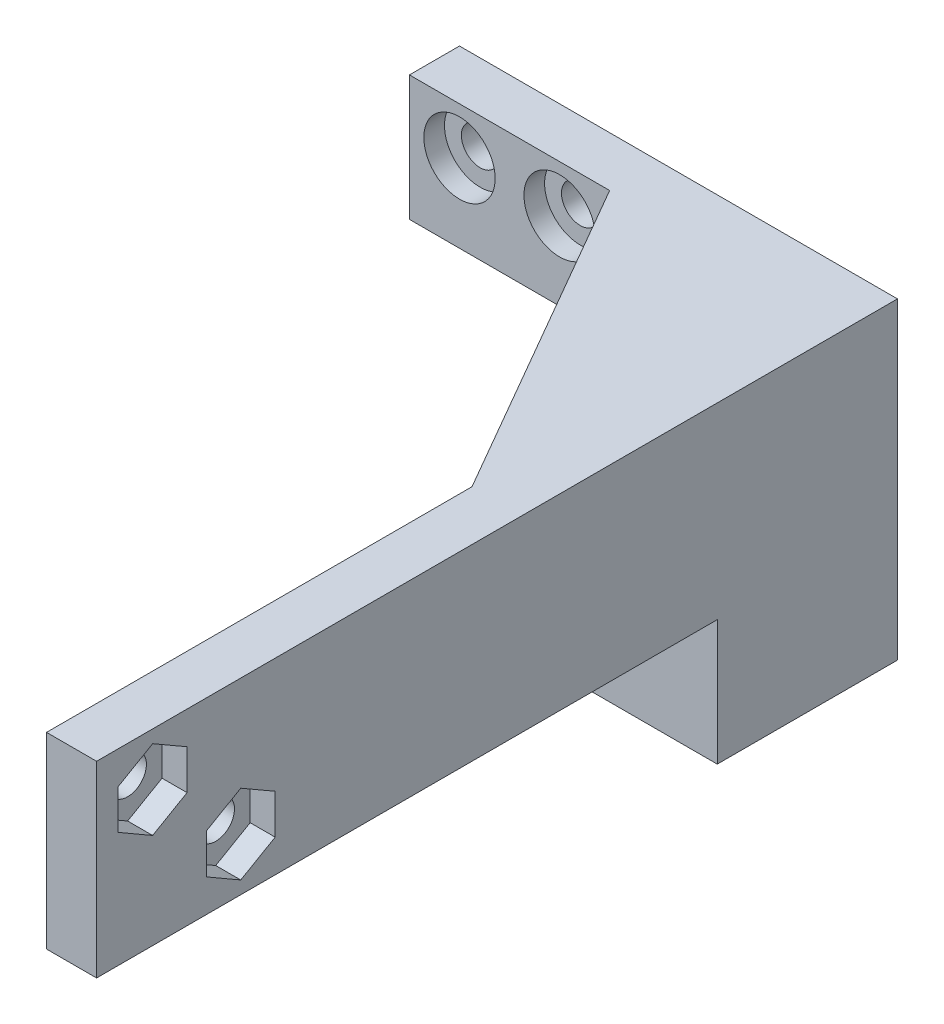
ISO-10303-21;
HEADER;
FILE_DESCRIPTION(('STEP AP214'),'2;1');
FILE_NAME('part.step','',(''),(''),'','','');
FILE_SCHEMA(('AUTOMOTIVE_DESIGN { 1 0 10303 214 1 1 1 1 }'));
ENDSEC;
DATA;
#1=APPLICATION_CONTEXT('core data for automotive mechanical design processes');
#2=APPLICATION_PROTOCOL_DEFINITION('international standard','automotive_design',2000,#1);
#3=PRODUCT_CONTEXT('',#1,'mechanical');
#4=PRODUCT('Part','Part','',(#3));
#5=PRODUCT_RELATED_PRODUCT_CATEGORY('part','',(#4));
#6=PRODUCT_DEFINITION_FORMATION('','',#4);
#7=PRODUCT_DEFINITION_CONTEXT('part definition',#1,'design');
#8=PRODUCT_DEFINITION('design','',#6,#7);
#9=PRODUCT_DEFINITION_SHAPE('','',#8);
#10=(LENGTH_UNIT() NAMED_UNIT(*) SI_UNIT(.MILLI.,.METRE.));
#11=(NAMED_UNIT(*) PLANE_ANGLE_UNIT() SI_UNIT($,.RADIAN.));
#12=(NAMED_UNIT(*) SI_UNIT($,.STERADIAN.) SOLID_ANGLE_UNIT());
#13=UNCERTAINTY_MEASURE_WITH_UNIT(LENGTH_MEASURE(1.E-05),#10,'distance_accuracy_value','');
#14=(GEOMETRIC_REPRESENTATION_CONTEXT(3) GLOBAL_UNCERTAINTY_ASSIGNED_CONTEXT((#13)) GLOBAL_UNIT_ASSIGNED_CONTEXT((#10,
#11,#12)) REPRESENTATION_CONTEXT('',''));
#15=CARTESIAN_POINT('',(0.,0.,0.));
#16=DIRECTION('',(0.,0.,1.));
#17=DIRECTION('',(1.,0.,0.));
#18=AXIS2_PLACEMENT_3D('',#15,#16,#17);
#19=CARTESIAN_POINT('',(86.001,83.5733896832576,59.52));
#20=DIRECTION('',(-1.,0.,0.));
#21=DIRECTION('',(0.,0.,1.));
#22=AXIS2_PLACEMENT_3D('',#19,#20,#21);
#23=CYLINDRICAL_SURFACE('',#22,1.5);
#24=CARTESIAN_POINT('',(82.,83.5733896832576,59.52));
#25=DIRECTION('',(-1.,0.,0.));
#26=DIRECTION('',(0.,0.,1.));
#27=AXIS2_PLACEMENT_3D('',#24,#25,#26);
#28=CIRCLE('',#27,1.5);
#29=CARTESIAN_POINT('',(82.,83.5733896832576,61.02));
#30=VERTEX_POINT('',#29);
#31=EDGE_CURVE('E332',#30,#30,#28,.T.);
#32=ORIENTED_EDGE('',*,*,#31,.T.);
#33=EDGE_LOOP('',(#32));
#34=FACE_BOUND('',#33,.T.);
#35=CARTESIAN_POINT('',(84.,83.5733896832576,59.52));
#36=DIRECTION('',(1.,0.,0.));
#37=DIRECTION('',(0.,0.,-1.));
#38=AXIS2_PLACEMENT_3D('',#35,#36,#37);
#39=CIRCLE('',#38,1.5);
#40=CARTESIAN_POINT('',(84.,83.5733896832576,58.02));
#41=VERTEX_POINT('',#40);
#42=EDGE_CURVE('E335',#41,#41,#39,.F.);
#43=ORIENTED_EDGE('',*,*,#42,.F.);
#44=EDGE_LOOP('',(#43));
#45=FACE_BOUND('',#44,.T.);
#46=ADVANCED_FACE('F37',(#34,#45),#23,.F.);
#47=CARTESIAN_POINT('',(86.001,76.9733896832576,52.48));
#48=DIRECTION('',(-1.,0.,0.));
#49=DIRECTION('',(0.,0.,1.));
#50=AXIS2_PLACEMENT_3D('',#47,#48,#49);
#51=CYLINDRICAL_SURFACE('',#50,1.5);
#52=CARTESIAN_POINT('',(82.,76.9733896832576,52.48));
#53=DIRECTION('',(-1.,0.,0.));
#54=DIRECTION('',(0.,0.,1.));
#55=AXIS2_PLACEMENT_3D('',#52,#53,#54);
#56=CIRCLE('',#55,1.5);
#57=CARTESIAN_POINT('',(82.,76.9733896832576,53.98));
#58=VERTEX_POINT('',#57);
#59=EDGE_CURVE('E328',#58,#58,#56,.T.);
#60=ORIENTED_EDGE('',*,*,#59,.T.);
#61=EDGE_LOOP('',(#60));
#62=FACE_BOUND('',#61,.T.);
#63=CARTESIAN_POINT('',(84.,76.9733896832576,52.48));
#64=DIRECTION('',(1.,0.,0.));
#65=DIRECTION('',(0.,0.,-1.));
#66=AXIS2_PLACEMENT_3D('',#63,#64,#65);
#67=CIRCLE('',#66,1.5);
#68=CARTESIAN_POINT('',(84.,76.9733896832576,50.98));
#69=VERTEX_POINT('',#68);
#70=EDGE_CURVE('E272',#69,#69,#67,.F.);
#71=ORIENTED_EDGE('',*,*,#70,.F.);
#72=EDGE_LOOP('',(#71));
#73=FACE_BOUND('',#72,.T.);
#74=ADVANCED_FACE('F452',(#62,#73),#51,.F.);
#75=CARTESIAN_POINT('',(55.,84.0233896832576,4.));
#76=DIRECTION('',(0.,0.,-1.));
#77=DIRECTION('',(-1.,0.,0.));
#78=AXIS2_PLACEMENT_3D('',#75,#76,#77);
#79=CYLINDRICAL_SURFACE('',#78,1.5);
#80=CARTESIAN_POINT('',(55.,84.0233896832576,0.));
#81=DIRECTION('',(0.,0.,1.));
#82=DIRECTION('',(1.,0.,0.));
#83=AXIS2_PLACEMENT_3D('',#80,#81,#82);
#84=CIRCLE('',#83,1.5);
#85=CARTESIAN_POINT('',(56.5,84.0233896832576,0.));
#86=VERTEX_POINT('',#85);
#87=EDGE_CURVE('E388',#86,#86,#84,.T.);
#88=ORIENTED_EDGE('',*,*,#87,.F.);
#89=EDGE_LOOP('',(#88));
#90=FACE_BOUND('',#89,.T.);
#91=CARTESIAN_POINT('',(55.,84.0233896832576,2.35));
#92=DIRECTION('',(0.,0.,1.));
#93=DIRECTION('',(1.,0.,0.));
#94=AXIS2_PLACEMENT_3D('',#91,#92,#93);
#95=CIRCLE('',#94,1.5);
#96=CARTESIAN_POINT('',(56.5,84.0233896832576,2.35));
#97=VERTEX_POINT('',#96);
#98=EDGE_CURVE('E352',#97,#97,#95,.T.);
#99=ORIENTED_EDGE('',*,*,#98,.T.);
#100=EDGE_LOOP('',(#99));
#101=FACE_BOUND('',#100,.T.);
#102=ADVANCED_FACE('F458',(#90,#101),#79,.F.);
#103=CARTESIAN_POINT('',(63.,84.0233896832576,4.));
#104=DIRECTION('',(0.,0.,-1.));
#105=DIRECTION('',(-1.,0.,0.));
#106=AXIS2_PLACEMENT_3D('',#103,#104,#105);
#107=CYLINDRICAL_SURFACE('',#106,1.5);
#108=CARTESIAN_POINT('',(63.,84.0233896832576,0.));
#109=DIRECTION('',(0.,0.,1.));
#110=DIRECTION('',(1.,0.,0.));
#111=AXIS2_PLACEMENT_3D('',#108,#109,#110);
#112=CIRCLE('',#111,1.5);
#113=CARTESIAN_POINT('',(64.5,84.0233896832576,0.));
#114=VERTEX_POINT('',#113);
#115=EDGE_CURVE('E378',#114,#114,#112,.T.);
#116=ORIENTED_EDGE('',*,*,#115,.F.);
#117=EDGE_LOOP('',(#116));
#118=FACE_BOUND('',#117,.T.);
#119=CARTESIAN_POINT('',(63.,84.0233896832576,2.35));
#120=DIRECTION('',(0.,0.,1.));
#121=DIRECTION('',(1.,0.,0.));
#122=AXIS2_PLACEMENT_3D('',#119,#120,#121);
#123=CIRCLE('',#122,1.5);
#124=CARTESIAN_POINT('',(64.5,84.0233896832576,2.35));
#125=VERTEX_POINT('',#124);
#126=EDGE_CURVE('E339',#125,#125,#123,.T.);
#127=ORIENTED_EDGE('',*,*,#126,.T.);
#128=EDGE_LOOP('',(#127));
#129=FACE_BOUND('',#128,.T.);
#130=ADVANCED_FACE('F490',(#118,#129),#107,.F.);
#131=CARTESIAN_POINT('',(0.,0.,4.));
#132=DIRECTION('',(0.,0.,1.));
#133=DIRECTION('',(1.,0.,0.));
#134=AXIS2_PLACEMENT_3D('',#131,#132,#133);
#135=PLANE('',#134);
#136=DIRECTION('',(-1.,0.,0.));
#137=VECTOR('',#136,1.);
#138=CARTESIAN_POINT('',(1.43909679882495E-13,77.7733896832577,4.));
#139=LINE('',#138,#137);
#140=CARTESIAN_POINT('',(67.,77.7733896832576,4.));
#141=VERTEX_POINT('',#140);
#142=CARTESIAN_POINT('',(51.,77.7733896832576,4.));
#143=VERTEX_POINT('',#142);
#144=EDGE_CURVE('E231',#141,#143,#139,.T.);
#145=ORIENTED_EDGE('',*,*,#144,.F.);
#146=DIRECTION('',(0.,1.,0.));
#147=VECTOR('',#146,1.);
#148=CARTESIAN_POINT('',(67.,42.7567276436504,4.));
#149=LINE('',#148,#147);
#150=CARTESIAN_POINT('',(67.,87.7733896832576,4.));
#151=VERTEX_POINT('',#150);
#152=EDGE_CURVE('E356',#141,#151,#149,.T.);
#153=ORIENTED_EDGE('',*,*,#152,.T.);
#154=DIRECTION('',(-1.,0.,0.));
#155=VECTOR('',#154,1.);
#156=CARTESIAN_POINT('',(0.,87.7733896832577,4.));
#157=LINE('',#156,#155);
#158=CARTESIAN_POINT('',(51.,87.7733896832576,4.));
#159=VERTEX_POINT('',#158);
#160=EDGE_CURVE('E375',#151,#159,#157,.T.);
#161=ORIENTED_EDGE('',*,*,#160,.T.);
#162=DIRECTION('',(0.,-1.,0.));
#163=VECTOR('',#162,1.);
#164=CARTESIAN_POINT('',(50.9999999999999,0.,4.));
#165=LINE('',#164,#163);
#166=EDGE_CURVE('E377',#159,#143,#165,.T.);
#167=ORIENTED_EDGE('',*,*,#166,.T.);
#168=EDGE_LOOP('',(#145,#153,#161,#167));
#169=FACE_BOUND('',#168,.T.);
#170=CARTESIAN_POINT('',(63.,84.0233896832576,4.));
#171=DIRECTION('',(0.,0.,1.));
#172=DIRECTION('',(1.,0.,0.));
#173=AXIS2_PLACEMENT_3D('',#170,#171,#172);
#174=CIRCLE('',#173,2.85);
#175=CARTESIAN_POINT('',(65.85,84.0233896832576,4.));
#176=VERTEX_POINT('',#175);
#177=EDGE_CURVE('E340',#176,#176,#174,.T.);
#178=ORIENTED_EDGE('',*,*,#177,.F.);
#179=EDGE_LOOP('',(#178));
#180=FACE_BOUND('',#179,.T.);
#181=CARTESIAN_POINT('',(55.,84.0233896832576,4.));
#182=DIRECTION('',(0.,0.,1.));
#183=DIRECTION('',(1.,0.,0.));
#184=AXIS2_PLACEMENT_3D('',#181,#182,#183);
#185=CIRCLE('',#184,2.85);
#186=CARTESIAN_POINT('',(57.85,84.0233896832576,4.));
#187=VERTEX_POINT('',#186);
#188=EDGE_CURVE('E331',#187,#187,#185,.T.);
#189=ORIENTED_EDGE('',*,*,#188,.F.);
#190=EDGE_LOOP('',(#189));
#191=FACE_BOUND('',#190,.T.);
#192=ADVANCED_FACE('F434',(#169,#180,#191),#135,.T.);
#193=CARTESIAN_POINT('',(82.,87.7733896832576,64.));
#194=DIRECTION('',(1.,0.,0.));
#195=DIRECTION('',(0.,0.,-1.));
#196=AXIS2_PLACEMENT_3D('',#193,#194,#195);
#197=PLANE('',#196);
#198=ORIENTED_EDGE('',*,*,#59,.F.);
#199=EDGE_LOOP('',(#198));
#200=FACE_BOUND('',#199,.T.);
#201=ORIENTED_EDGE('',*,*,#31,.F.);
#202=EDGE_LOOP('',(#201));
#203=FACE_BOUND('',#202,.T.);
#204=DIRECTION('',(0.,1.,0.));
#205=VECTOR('',#204,1.);
#206=CARTESIAN_POINT('',(82.,42.7567276436504,30.));
#207=LINE('',#206,#205);
#208=CARTESIAN_POINT('',(82.,72.7733896832576,30.));
#209=VERTEX_POINT('',#208);
#210=CARTESIAN_POINT('',(82.,87.7733896832576,30.));
#211=VERTEX_POINT('',#210);
#212=EDGE_CURVE('E351',#209,#211,#207,.T.);
#213=ORIENTED_EDGE('',*,*,#212,.F.);
#214=DIRECTION('',(0.,0.,-1.));
#215=VECTOR('',#214,1.);
#216=CARTESIAN_POINT('',(82.,72.7733896832576,64.));
#217=LINE('',#216,#215);
#218=CARTESIAN_POINT('',(82.,72.7733896832576,64.));
#219=VERTEX_POINT('',#218);
#220=EDGE_CURVE('E369',#219,#209,#217,.T.);
#221=ORIENTED_EDGE('',*,*,#220,.F.);
#222=DIRECTION('',(0.,-1.,0.));
#223=VECTOR('',#222,1.);
#224=CARTESIAN_POINT('',(82.,87.7733896832576,64.));
#225=LINE('',#224,#223);
#226=CARTESIAN_POINT('',(82.,87.7733896832576,64.));
#227=VERTEX_POINT('',#226);
#228=EDGE_CURVE('E364',#227,#219,#225,.T.);
#229=ORIENTED_EDGE('',*,*,#228,.F.);
#230=DIRECTION('',(0.,0.,-1.));
#231=VECTOR('',#230,1.);
#232=CARTESIAN_POINT('',(82.,87.7733896832576,64.));
#233=LINE('',#232,#231);
#234=EDGE_CURVE('E372',#227,#211,#233,.T.);
#235=ORIENTED_EDGE('',*,*,#234,.T.);
#236=EDGE_LOOP('',(#213,#221,#229,#235));
#237=FACE_BOUND('',#236,.T.);
#238=ADVANCED_FACE('F426',(#200,#203,#237),#197,.F.);
#239=CARTESIAN_POINT('',(0.,87.7733896832577,4.));
#240=DIRECTION('',(0.,-1.,0.));
#241=DIRECTION('',(1.,0.,0.));
#242=AXIS2_PLACEMENT_3D('',#239,#240,#241);
#243=PLANE('',#242);
#244=ORIENTED_EDGE('',*,*,#160,.F.);
#245=DIRECTION('',(0.499722453489578,0.,0.8661855860486));
#246=VECTOR('',#245,1.);
#247=CARTESIAN_POINT('',(67.,87.7733896832576,3.99999999999999));
#248=LINE('',#247,#246);
#249=EDGE_CURVE('E348',#151,#211,#248,.T.);
#250=ORIENTED_EDGE('',*,*,#249,.T.);
#251=ORIENTED_EDGE('',*,*,#234,.F.);
#252=DIRECTION('',(-1.,0.,0.));
#253=VECTOR('',#252,1.);
#254=CARTESIAN_POINT('',(86.,87.7733896832576,64.));
#255=LINE('',#254,#253);
#256=CARTESIAN_POINT('',(86.,87.7733896832576,64.));
#257=VERTEX_POINT('',#256);
#258=EDGE_CURVE('E362',#257,#227,#255,.T.);
#259=ORIENTED_EDGE('',*,*,#258,.F.);
#260=DIRECTION('',(0.,0.,-1.));
#261=VECTOR('',#260,1.);
#262=CARTESIAN_POINT('',(86.,87.7733896832576,4.));
#263=LINE('',#262,#261);
#264=CARTESIAN_POINT('',(86.,87.7733896832576,0.));
#265=VERTEX_POINT('',#264);
#266=EDGE_CURVE('E381',#257,#265,#263,.T.);
#267=ORIENTED_EDGE('',*,*,#266,.T.);
#268=DIRECTION('',(-1.,0.,0.));
#269=VECTOR('',#268,1.);
#270=CARTESIAN_POINT('',(0.,87.7733896832577,0.));
#271=LINE('',#270,#269);
#272=CARTESIAN_POINT('',(51.,87.7733896832576,0.));
#273=VERTEX_POINT('',#272);
#274=EDGE_CURVE('E374',#265,#273,#271,.T.);
#275=ORIENTED_EDGE('',*,*,#274,.T.);
#276=DIRECTION('',(0.,0.,-1.));
#277=VECTOR('',#276,1.);
#278=CARTESIAN_POINT('',(51.,87.7733896832576,4.));
#279=LINE('',#278,#277);
#280=EDGE_CURVE('E396',#159,#273,#279,.T.);
#281=ORIENTED_EDGE('',*,*,#280,.F.);
#282=EDGE_LOOP('',(#244,#250,#251,#259,#267,#275,#281));
#283=FACE_BOUND('',#282,.T.);
#284=ADVANCED_FACE('F39',(#283),#243,.F.);
#285=CARTESIAN_POINT('',(50.9999999999999,0.,4.));
#286=DIRECTION('',(1.,0.,0.));
#287=DIRECTION('',(0.,1.,0.));
#288=AXIS2_PLACEMENT_3D('',#285,#286,#287);
#289=PLANE('',#288);
#290=DIRECTION('',(0.,-1.,0.));
#291=VECTOR('',#290,1.);
#292=CARTESIAN_POINT('',(50.9999999999999,0.,0.));
#293=LINE('',#292,#291);
#294=CARTESIAN_POINT('',(51.,77.7733896832576,0.));
#295=VERTEX_POINT('',#294);
#296=EDGE_CURVE('E384',#273,#295,#293,.T.);
#297=ORIENTED_EDGE('',*,*,#296,.T.);
#298=DIRECTION('',(0.,0.,-1.));
#299=VECTOR('',#298,1.);
#300=CARTESIAN_POINT('',(51.,77.7733896832576,0.));
#301=LINE('',#300,#299);
#302=EDGE_CURVE('E200',#143,#295,#301,.T.);
#303=ORIENTED_EDGE('',*,*,#302,.F.);
#304=ORIENTED_EDGE('',*,*,#166,.F.);
#305=ORIENTED_EDGE('',*,*,#280,.T.);
#306=EDGE_LOOP('',(#297,#303,#304,#305));
#307=FACE_BOUND('',#306,.T.);
#308=ADVANCED_FACE('F438',(#307),#289,.F.);
#309=CARTESIAN_POINT('',(0.,72.7733896832576,4.));
#310=DIRECTION('',(0.,-1.,0.));
#311=DIRECTION('',(0.,0.,-1.));
#312=AXIS2_PLACEMENT_3D('',#309,#310,#311);
#313=PLANE('',#312);
#314=DIRECTION('',(-1.,0.,0.));
#315=VECTOR('',#314,1.);
#316=CARTESIAN_POINT('',(73.,72.7733896832576,14.4));
#317=LINE('',#316,#315);
#318=CARTESIAN_POINT('',(86.,72.7733896832576,14.4));
#319=VERTEX_POINT('',#318);
#320=CARTESIAN_POINT('',(73.,72.7733896832576,14.4));
#321=VERTEX_POINT('',#320);
#322=EDGE_CURVE('E52',#319,#321,#317,.T.);
#323=ORIENTED_EDGE('',*,*,#322,.F.);
#324=DIRECTION('',(0.,0.,-1.));
#325=VECTOR('',#324,1.);
#326=CARTESIAN_POINT('',(86.,72.7733896832576,4.));
#327=LINE('',#326,#325);
#328=CARTESIAN_POINT('',(86.,72.7733896832576,64.));
#329=VERTEX_POINT('',#328);
#330=EDGE_CURVE('E394',#329,#319,#327,.T.);
#331=ORIENTED_EDGE('',*,*,#330,.F.);
#332=DIRECTION('',(1.,0.,0.));
#333=VECTOR('',#332,1.);
#334=CARTESIAN_POINT('',(86.,72.7733896832576,64.));
#335=LINE('',#334,#333);
#336=EDGE_CURVE('E366',#219,#329,#335,.T.);
#337=ORIENTED_EDGE('',*,*,#336,.F.);
#338=ORIENTED_EDGE('',*,*,#220,.T.);
#339=DIRECTION('',(-0.499722453489578,0.,-0.8661855860486));
#340=VECTOR('',#339,1.);
#341=CARTESIAN_POINT('',(67.,72.7733896832576,4.));
#342=LINE('',#341,#340);
#343=EDGE_CURVE('E353',#209,#321,#342,.T.);
#344=ORIENTED_EDGE('',*,*,#343,.T.);
#345=EDGE_LOOP('',(#323,#331,#337,#338,#344));
#346=FACE_BOUND('',#345,.T.);
#347=ADVANCED_FACE('F418',(#346),#313,.T.);
#348=CARTESIAN_POINT('',(86.,0.,4.));
#349=DIRECTION('',(1.,0.,0.));
#350=DIRECTION('',(0.,0.,-1.));
#351=AXIS2_PLACEMENT_3D('',#348,#349,#350);
#352=PLANE('',#351);
#353=DIRECTION('',(0.,-1.,0.));
#354=VECTOR('',#353,1.);
#355=CARTESIAN_POINT('',(86.,78.5611029235291,55.23));
#356=LINE('',#355,#354);
#357=CARTESIAN_POINT('',(86.,78.5611029235291,55.23));
#358=VERTEX_POINT('',#357);
#359=CARTESIAN_POINT('',(86.,75.3856764429861,55.23));
#360=VERTEX_POINT('',#359);
#361=EDGE_CURVE('E60',#358,#360,#356,.T.);
#362=ORIENTED_EDGE('',*,*,#361,.F.);
#363=DIRECTION('',(0.,-0.5,0.866025403784439));
#364=VECTOR('',#363,1.);
#365=CARTESIAN_POINT('',(86.,80.1488161638006,52.48));
#366=LINE('',#365,#364);
#367=CARTESIAN_POINT('',(86.,80.1488161638006,52.48));
#368=VERTEX_POINT('',#367);
#369=EDGE_CURVE('E238',#368,#358,#366,.T.);
#370=ORIENTED_EDGE('',*,*,#369,.F.);
#371=DIRECTION('',(0.,0.500000000000002,0.866025403784438));
#372=VECTOR('',#371,1.);
#373=CARTESIAN_POINT('',(86.,78.5611029235291,49.73));
#374=LINE('',#373,#372);
#375=CARTESIAN_POINT('',(86.,78.5611029235291,49.73));
#376=VERTEX_POINT('',#375);
#377=EDGE_CURVE('E265',#376,#368,#374,.T.);
#378=ORIENTED_EDGE('',*,*,#377,.F.);
#379=DIRECTION('',(0.,1.,0.));
#380=VECTOR('',#379,1.);
#381=CARTESIAN_POINT('',(86.,75.3856764429862,49.73));
#382=LINE('',#381,#380);
#383=CARTESIAN_POINT('',(86.,75.3856764429862,49.73));
#384=VERTEX_POINT('',#383);
#385=EDGE_CURVE('E262',#384,#376,#382,.T.);
#386=ORIENTED_EDGE('',*,*,#385,.F.);
#387=DIRECTION('',(0.,0.5,-0.866025403784438));
#388=VECTOR('',#387,1.);
#389=CARTESIAN_POINT('',(86.,73.7979632027147,52.48));
#390=LINE('',#389,#388);
#391=CARTESIAN_POINT('',(86.,73.7979632027147,52.48));
#392=VERTEX_POINT('',#391);
#393=EDGE_CURVE('E259',#392,#384,#390,.T.);
#394=ORIENTED_EDGE('',*,*,#393,.F.);
#395=DIRECTION('',(0.,-0.500000000000001,-0.866025403784438));
#396=VECTOR('',#395,1.);
#397=CARTESIAN_POINT('',(86.,75.3856764429862,55.23));
#398=LINE('',#397,#396);
#399=EDGE_CURVE('E255',#360,#392,#398,.T.);
#400=ORIENTED_EDGE('',*,*,#399,.F.);
#401=EDGE_LOOP('',(#362,#370,#378,#386,#394,#400));
#402=FACE_BOUND('',#401,.T.);
#403=DIRECTION('',(0.,-1.,0.));
#404=VECTOR('',#403,1.);
#405=CARTESIAN_POINT('',(86.,85.1611029235291,62.27));
#406=LINE('',#405,#404);
#407=CARTESIAN_POINT('',(86.,85.1611029235291,62.27));
#408=VERTEX_POINT('',#407);
#409=CARTESIAN_POINT('',(86.,81.9856764429862,62.27));
#410=VERTEX_POINT('',#409);
#411=EDGE_CURVE('E233',#408,#410,#406,.T.);
#412=ORIENTED_EDGE('',*,*,#411,.F.);
#413=DIRECTION('',(0.,-0.499999999999999,0.866025403784439));
#414=VECTOR('',#413,1.);
#415=CARTESIAN_POINT('',(86.,86.7488161638006,59.52));
#416=LINE('',#415,#414);
#417=CARTESIAN_POINT('',(86.,86.7488161638006,59.52));
#418=VERTEX_POINT('',#417);
#419=EDGE_CURVE('E286',#418,#408,#416,.T.);
#420=ORIENTED_EDGE('',*,*,#419,.F.);
#421=DIRECTION('',(0.,0.499999999999999,0.866025403784439));
#422=VECTOR('',#421,1.);
#423=CARTESIAN_POINT('',(86.,85.1611029235291,56.77));
#424=LINE('',#423,#422);
#425=CARTESIAN_POINT('',(86.,85.1611029235291,56.77));
#426=VERTEX_POINT('',#425);
#427=EDGE_CURVE('E312',#426,#418,#424,.T.);
#428=ORIENTED_EDGE('',*,*,#427,.F.);
#429=DIRECTION('',(0.,1.,0.));
#430=VECTOR('',#429,1.);
#431=CARTESIAN_POINT('',(86.,81.9856764429862,56.77));
#432=LINE('',#431,#430);
#433=CARTESIAN_POINT('',(86.,81.9856764429862,56.77));
#434=VERTEX_POINT('',#433);
#435=EDGE_CURVE('E309',#434,#426,#432,.T.);
#436=ORIENTED_EDGE('',*,*,#435,.F.);
#437=DIRECTION('',(0.,0.499999999999998,-0.86602540378444));
#438=VECTOR('',#437,1.);
#439=CARTESIAN_POINT('',(86.,80.3979632027147,59.52));
#440=LINE('',#439,#438);
#441=CARTESIAN_POINT('',(86.,80.3979632027147,59.52));
#442=VERTEX_POINT('',#441);
#443=EDGE_CURVE('E306',#442,#434,#440,.T.);
#444=ORIENTED_EDGE('',*,*,#443,.F.);
#445=DIRECTION('',(0.,-0.499999999999997,-0.86602540378444));
#446=VECTOR('',#445,1.);
#447=CARTESIAN_POINT('',(86.,81.9856764429862,62.27));
#448=LINE('',#447,#446);
#449=EDGE_CURVE('E303',#410,#442,#448,.T.);
#450=ORIENTED_EDGE('',*,*,#449,.F.);
#451=EDGE_LOOP('',(#412,#420,#428,#436,#444,#450));
#452=FACE_BOUND('',#451,.T.);
#453=DIRECTION('',(0.,-1.,0.));
#454=VECTOR('',#453,1.);
#455=CARTESIAN_POINT('',(86.,0.,0.));
#456=LINE('',#455,#454);
#457=CARTESIAN_POINT('',(86.,62.7733896832576,0.));
#458=VERTEX_POINT('',#457);
#459=EDGE_CURVE('E208',#265,#458,#456,.T.);
#460=ORIENTED_EDGE('',*,*,#459,.F.);
#461=ORIENTED_EDGE('',*,*,#266,.F.);
#462=DIRECTION('',(0.,1.,0.));
#463=VECTOR('',#462,1.);
#464=CARTESIAN_POINT('',(86.,87.7733896832576,64.));
#465=LINE('',#464,#463);
#466=EDGE_CURVE('E355',#329,#257,#465,.T.);
#467=ORIENTED_EDGE('',*,*,#466,.F.);
#468=ORIENTED_EDGE('',*,*,#330,.T.);
#469=DIRECTION('',(0.,1.,0.));
#470=VECTOR('',#469,1.);
#471=CARTESIAN_POINT('',(86.,62.7733896832576,14.4));
#472=LINE('',#471,#470);
#473=CARTESIAN_POINT('',(86.,62.7733896832576,14.4));
#474=VERTEX_POINT('',#473);
#475=EDGE_CURVE('E224',#474,#319,#472,.T.);
#476=ORIENTED_EDGE('',*,*,#475,.F.);
#477=DIRECTION('',(0.,0.,1.));
#478=VECTOR('',#477,1.);
#479=CARTESIAN_POINT('',(86.,62.7733896832576,14.4));
#480=LINE('',#479,#478);
#481=EDGE_CURVE('E211',#458,#474,#480,.T.);
#482=ORIENTED_EDGE('',*,*,#481,.F.);
#483=EDGE_LOOP('',(#460,#461,#467,#468,#476,#482));
#484=FACE_BOUND('',#483,.T.);
#485=ADVANCED_FACE('F415',(#402,#452,#484),#352,.T.);
#486=CARTESIAN_POINT('',(0.,0.,0.));
#487=DIRECTION('',(0.,0.,1.));
#488=DIRECTION('',(1.,0.,0.));
#489=AXIS2_PLACEMENT_3D('',#486,#487,#488);
#490=PLANE('',#489);
#491=DIRECTION('',(0.,-1.,0.));
#492=VECTOR('',#491,1.);
#493=CARTESIAN_POINT('',(73.,72.7733896832576,0.));
#494=LINE('',#493,#492);
#495=CARTESIAN_POINT('',(73.,77.7733896832576,0.));
#496=VERTEX_POINT('',#495);
#497=CARTESIAN_POINT('',(73.,62.7733896832576,0.));
#498=VERTEX_POINT('',#497);
#499=EDGE_CURVE('E189',#496,#498,#494,.T.);
#500=ORIENTED_EDGE('',*,*,#499,.F.);
#501=DIRECTION('',(-1.,0.,0.));
#502=VECTOR('',#501,1.);
#503=CARTESIAN_POINT('',(73.,77.7733896832576,0.));
#504=LINE('',#503,#502);
#505=EDGE_CURVE('E228',#496,#295,#504,.T.);
#506=ORIENTED_EDGE('',*,*,#505,.T.);
#507=ORIENTED_EDGE('',*,*,#296,.F.);
#508=ORIENTED_EDGE('',*,*,#274,.F.);
#509=ORIENTED_EDGE('',*,*,#459,.T.);
#510=DIRECTION('',(1.,0.,0.));
#511=VECTOR('',#510,1.);
#512=CARTESIAN_POINT('',(73.,62.7733896832576,0.));
#513=LINE('',#512,#511);
#514=EDGE_CURVE('E203',#498,#458,#513,.T.);
#515=ORIENTED_EDGE('',*,*,#514,.F.);
#516=EDGE_LOOP('',(#500,#506,#507,#508,#509,#515));
#517=FACE_BOUND('',#516,.T.);
#518=ORIENTED_EDGE('',*,*,#87,.T.);
#519=EDGE_LOOP('',(#518));
#520=FACE_BOUND('',#519,.T.);
#521=ORIENTED_EDGE('',*,*,#115,.T.);
#522=EDGE_LOOP('',(#521));
#523=FACE_BOUND('',#522,.T.);
#524=ADVANCED_FACE('F204',(#517,#520,#523),#490,.F.);
#525=CARTESIAN_POINT('',(0.,0.,64.));
#526=DIRECTION('',(0.,0.,-1.));
#527=DIRECTION('',(-1.,0.,0.));
#528=AXIS2_PLACEMENT_3D('',#525,#526,#527);
#529=PLANE('',#528);
#530=ORIENTED_EDGE('',*,*,#466,.T.);
#531=ORIENTED_EDGE('',*,*,#258,.T.);
#532=ORIENTED_EDGE('',*,*,#228,.T.);
#533=ORIENTED_EDGE('',*,*,#336,.T.);
#534=EDGE_LOOP('',(#530,#531,#532,#533));
#535=FACE_BOUND('',#534,.T.);
#536=ADVANCED_FACE('F420',(#535),#529,.F.);
#537=CARTESIAN_POINT('',(67.,42.7567276436504,4.));
#538=DIRECTION('',(0.8661855860486,0.,-0.499722453489577));
#539=DIRECTION('',(-0.499722453489578,0.,-0.8661855860486));
#540=AXIS2_PLACEMENT_3D('',#537,#538,#539);
#541=PLANE('',#540);
#542=ORIENTED_EDGE('',*,*,#152,.F.);
#543=DIRECTION('',(0.499722453489578,0.,0.8661855860486));
#544=VECTOR('',#543,1.);
#545=CARTESIAN_POINT('',(67.,77.7733896832576,4.00000000000003));
#546=LINE('',#545,#544);
#547=CARTESIAN_POINT('',(73.,77.7733896832576,14.4));
#548=VERTEX_POINT('',#547);
#549=EDGE_CURVE('E11',#141,#548,#546,.T.);
#550=ORIENTED_EDGE('',*,*,#549,.T.);
#551=DIRECTION('',(0.,-1.,0.));
#552=VECTOR('',#551,1.);
#553=CARTESIAN_POINT('',(72.9999999999999,42.7567276436503,14.3999999999998));
#554=LINE('',#553,#552);
#555=EDGE_CURVE('E45',#548,#321,#554,.T.);
#556=ORIENTED_EDGE('',*,*,#555,.T.);
#557=ORIENTED_EDGE('',*,*,#343,.F.);
#558=ORIENTED_EDGE('',*,*,#212,.T.);
#559=ORIENTED_EDGE('',*,*,#249,.F.);
#560=EDGE_LOOP('',(#542,#550,#556,#557,#558,#559));
#561=FACE_BOUND('',#560,.T.);
#562=ADVANCED_FACE('F410',(#561),#541,.F.);
#563=CARTESIAN_POINT('',(63.,84.0233896832576,2.35));
#564=DIRECTION('',(0.,0.,1.));
#565=DIRECTION('',(1.,0.,0.));
#566=AXIS2_PLACEMENT_3D('',#563,#564,#565);
#567=CYLINDRICAL_SURFACE('',#566,2.85);
#568=CARTESIAN_POINT('',(63.,84.0233896832576,2.35));
#569=DIRECTION('',(0.,0.,1.));
#570=DIRECTION('',(1.,0.,0.));
#571=AXIS2_PLACEMENT_3D('',#568,#569,#570);
#572=CIRCLE('',#571,2.85);
#573=CARTESIAN_POINT('',(65.85,84.0233896832576,2.35));
#574=VERTEX_POINT('',#573);
#575=EDGE_CURVE('E336',#574,#574,#572,.T.);
#576=ORIENTED_EDGE('',*,*,#575,.F.);
#577=EDGE_LOOP('',(#576));
#578=FACE_BOUND('',#577,.T.);
#579=ORIENTED_EDGE('',*,*,#177,.T.);
#580=EDGE_LOOP('',(#579));
#581=FACE_BOUND('',#580,.T.);
#582=ADVANCED_FACE('F468',(#578,#581),#567,.F.);
#583=CARTESIAN_POINT('',(63.,84.0233896832576,2.35));
#584=DIRECTION('',(0.,0.,1.));
#585=DIRECTION('',(1.,0.,0.));
#586=AXIS2_PLACEMENT_3D('',#583,#584,#585);
#587=PLANE('',#586);
#588=ORIENTED_EDGE('',*,*,#126,.F.);
#589=EDGE_LOOP('',(#588));
#590=FACE_BOUND('',#589,.T.);
#591=ORIENTED_EDGE('',*,*,#575,.T.);
#592=EDGE_LOOP('',(#591));
#593=FACE_BOUND('',#592,.T.);
#594=ADVANCED_FACE('F464',(#590,#593),#587,.T.);
#595=CARTESIAN_POINT('',(55.,84.0233896832576,2.35));
#596=DIRECTION('',(0.,0.,1.));
#597=DIRECTION('',(1.,0.,0.));
#598=AXIS2_PLACEMENT_3D('',#595,#596,#597);
#599=CYLINDRICAL_SURFACE('',#598,2.85);
#600=CARTESIAN_POINT('',(55.,84.0233896832576,2.35));
#601=DIRECTION('',(0.,0.,1.));
#602=DIRECTION('',(1.,0.,0.));
#603=AXIS2_PLACEMENT_3D('',#600,#601,#602);
#604=CIRCLE('',#603,2.85);
#605=CARTESIAN_POINT('',(57.85,84.0233896832576,2.35));
#606=VERTEX_POINT('',#605);
#607=EDGE_CURVE('E343',#606,#606,#604,.T.);
#608=ORIENTED_EDGE('',*,*,#607,.F.);
#609=EDGE_LOOP('',(#608));
#610=FACE_BOUND('',#609,.T.);
#611=ORIENTED_EDGE('',*,*,#188,.T.);
#612=EDGE_LOOP('',(#611));
#613=FACE_BOUND('',#612,.T.);
#614=ADVANCED_FACE('F467',(#610,#613),#599,.F.);
#615=CARTESIAN_POINT('',(55.,84.0233896832576,2.35));
#616=DIRECTION('',(0.,0.,1.));
#617=DIRECTION('',(1.,0.,0.));
#618=AXIS2_PLACEMENT_3D('',#615,#616,#617);
#619=PLANE('',#618);
#620=ORIENTED_EDGE('',*,*,#98,.F.);
#621=EDGE_LOOP('',(#620));
#622=FACE_BOUND('',#621,.T.);
#623=ORIENTED_EDGE('',*,*,#607,.T.);
#624=EDGE_LOOP('',(#623));
#625=FACE_BOUND('',#624,.T.);
#626=ADVANCED_FACE('F473',(#622,#625),#619,.T.);
#627=CARTESIAN_POINT('',(84.,0.,0.));
#628=DIRECTION('',(1.,0.,0.));
#629=DIRECTION('',(0.,0.,-1.));
#630=AXIS2_PLACEMENT_3D('',#627,#628,#629);
#631=PLANE('',#630);
#632=DIRECTION('',(0.,-1.,0.));
#633=VECTOR('',#632,1.);
#634=CARTESIAN_POINT('',(84.,78.5611029235291,55.23));
#635=LINE('',#634,#633);
#636=CARTESIAN_POINT('',(84.,78.5611029235291,55.23));
#637=VERTEX_POINT('',#636);
#638=CARTESIAN_POINT('',(84.,75.3856764429862,55.23));
#639=VERTEX_POINT('',#638);
#640=EDGE_CURVE('E234',#637,#639,#635,.T.);
#641=ORIENTED_EDGE('',*,*,#640,.T.);
#642=DIRECTION('',(0.,-0.500000000000001,-0.866025403784438));
#643=VECTOR('',#642,1.);
#644=CARTESIAN_POINT('',(84.,75.3856764429862,55.23));
#645=LINE('',#644,#643);
#646=CARTESIAN_POINT('',(84.,73.7979632027147,52.48));
#647=VERTEX_POINT('',#646);
#648=EDGE_CURVE('E237',#639,#647,#645,.T.);
#649=ORIENTED_EDGE('',*,*,#648,.T.);
#650=DIRECTION('',(0.,0.5,-0.866025403784438));
#651=VECTOR('',#650,1.);
#652=CARTESIAN_POINT('',(84.,73.7979632027147,52.48));
#653=LINE('',#652,#651);
#654=CARTESIAN_POINT('',(84.,75.3856764429862,49.73));
#655=VERTEX_POINT('',#654);
#656=EDGE_CURVE('E241',#647,#655,#653,.T.);
#657=ORIENTED_EDGE('',*,*,#656,.T.);
#658=DIRECTION('',(0.,1.,0.));
#659=VECTOR('',#658,1.);
#660=CARTESIAN_POINT('',(84.,75.3856764429862,49.73));
#661=LINE('',#660,#659);
#662=CARTESIAN_POINT('',(84.,78.5611029235291,49.73));
#663=VERTEX_POINT('',#662);
#664=EDGE_CURVE('E244',#655,#663,#661,.T.);
#665=ORIENTED_EDGE('',*,*,#664,.T.);
#666=DIRECTION('',(0.,0.500000000000002,0.866025403784438));
#667=VECTOR('',#666,1.);
#668=CARTESIAN_POINT('',(84.,78.5611029235291,49.73));
#669=LINE('',#668,#667);
#670=CARTESIAN_POINT('',(84.,80.1488161638006,52.48));
#671=VERTEX_POINT('',#670);
#672=EDGE_CURVE('E247',#663,#671,#669,.T.);
#673=ORIENTED_EDGE('',*,*,#672,.T.);
#674=DIRECTION('',(0.,-0.5,0.866025403784439));
#675=VECTOR('',#674,1.);
#676=CARTESIAN_POINT('',(84.,80.1488161638006,52.48));
#677=LINE('',#676,#675);
#678=EDGE_CURVE('E250',#671,#637,#677,.T.);
#679=ORIENTED_EDGE('',*,*,#678,.T.);
#680=EDGE_LOOP('',(#641,#649,#657,#665,#673,#679));
#681=FACE_BOUND('',#680,.T.);
#682=ORIENTED_EDGE('',*,*,#70,.T.);
#683=EDGE_LOOP('',(#682));
#684=FACE_BOUND('',#683,.T.);
#685=ADVANCED_FACE('F476',(#681,#684),#631,.T.);
#686=CARTESIAN_POINT('',(84.,78.5611029235291,55.23));
#687=DIRECTION('',(0.,0.,1.));
#688=DIRECTION('',(1.,0.,0.));
#689=AXIS2_PLACEMENT_3D('',#686,#687,#688);
#690=PLANE('',#689);
#691=ORIENTED_EDGE('',*,*,#361,.T.);
#692=DIRECTION('',(1.,0.,0.));
#693=VECTOR('',#692,1.);
#694=CARTESIAN_POINT('',(84.,75.3856764429862,55.23));
#695=LINE('',#694,#693);
#696=EDGE_CURVE('E253',#639,#360,#695,.T.);
#697=ORIENTED_EDGE('',*,*,#696,.F.);
#698=ORIENTED_EDGE('',*,*,#640,.F.);
#699=DIRECTION('',(1.,0.,0.));
#700=VECTOR('',#699,1.);
#701=CARTESIAN_POINT('',(84.,78.5611029235291,55.23));
#702=LINE('',#701,#700);
#703=EDGE_CURVE('E270',#637,#358,#702,.T.);
#704=ORIENTED_EDGE('',*,*,#703,.T.);
#705=EDGE_LOOP('',(#691,#697,#698,#704));
#706=FACE_BOUND('',#705,.T.);
#707=ADVANCED_FACE('F545',(#706),#690,.F.);
#708=CARTESIAN_POINT('',(84.,80.1488161638006,52.48));
#709=DIRECTION('',(0.,0.866025403784439,0.5));
#710=DIRECTION('',(0.,-0.5,0.866025403784439));
#711=AXIS2_PLACEMENT_3D('',#708,#709,#710);
#712=PLANE('',#711);
#713=ORIENTED_EDGE('',*,*,#369,.T.);
#714=ORIENTED_EDGE('',*,*,#703,.F.);
#715=ORIENTED_EDGE('',*,*,#678,.F.);
#716=DIRECTION('',(1.,0.,0.));
#717=VECTOR('',#716,1.);
#718=CARTESIAN_POINT('',(84.,80.1488161638006,52.48));
#719=LINE('',#718,#717);
#720=EDGE_CURVE('E273',#671,#368,#719,.T.);
#721=ORIENTED_EDGE('',*,*,#720,.T.);
#722=EDGE_LOOP('',(#713,#714,#715,#721));
#723=FACE_BOUND('',#722,.T.);
#724=ADVANCED_FACE('F554',(#723),#712,.F.);
#725=CARTESIAN_POINT('',(84.,78.5611029235291,49.73));
#726=DIRECTION('',(0.,0.866025403784438,-0.500000000000002));
#727=DIRECTION('',(0.,0.500000000000002,0.866025403784438));
#728=AXIS2_PLACEMENT_3D('',#725,#726,#727);
#729=PLANE('',#728);
#730=ORIENTED_EDGE('',*,*,#377,.T.);
#731=ORIENTED_EDGE('',*,*,#720,.F.);
#732=ORIENTED_EDGE('',*,*,#672,.F.);
#733=DIRECTION('',(1.,0.,0.));
#734=VECTOR('',#733,1.);
#735=CARTESIAN_POINT('',(84.,78.5611029235291,49.73));
#736=LINE('',#735,#734);
#737=EDGE_CURVE('E275',#663,#376,#736,.T.);
#738=ORIENTED_EDGE('',*,*,#737,.T.);
#739=EDGE_LOOP('',(#730,#731,#732,#738));
#740=FACE_BOUND('',#739,.T.);
#741=ADVANCED_FACE('F563',(#740),#729,.F.);
#742=CARTESIAN_POINT('',(84.,75.3856764429862,49.73));
#743=DIRECTION('',(0.,0.,-1.));
#744=DIRECTION('',(-1.,0.,0.));
#745=AXIS2_PLACEMENT_3D('',#742,#743,#744);
#746=PLANE('',#745);
#747=ORIENTED_EDGE('',*,*,#385,.T.);
#748=ORIENTED_EDGE('',*,*,#737,.F.);
#749=ORIENTED_EDGE('',*,*,#664,.F.);
#750=DIRECTION('',(1.,0.,0.));
#751=VECTOR('',#750,1.);
#752=CARTESIAN_POINT('',(84.,75.3856764429862,49.73));
#753=LINE('',#752,#751);
#754=EDGE_CURVE('E277',#655,#384,#753,.T.);
#755=ORIENTED_EDGE('',*,*,#754,.T.);
#756=EDGE_LOOP('',(#747,#748,#749,#755));
#757=FACE_BOUND('',#756,.T.);
#758=ADVANCED_FACE('F573',(#757),#746,.F.);
#759=CARTESIAN_POINT('',(84.,73.7979632027147,52.48));
#760=DIRECTION('',(0.,-0.866025403784439,-0.5));
#761=DIRECTION('',(0.,0.5,-0.866025403784438));
#762=AXIS2_PLACEMENT_3D('',#759,#760,#761);
#763=PLANE('',#762);
#764=ORIENTED_EDGE('',*,*,#393,.T.);
#765=ORIENTED_EDGE('',*,*,#754,.F.);
#766=ORIENTED_EDGE('',*,*,#656,.F.);
#767=DIRECTION('',(1.,0.,0.));
#768=VECTOR('',#767,1.);
#769=CARTESIAN_POINT('',(84.,73.7979632027147,52.48));
#770=LINE('',#769,#768);
#771=EDGE_CURVE('E279',#647,#392,#770,.T.);
#772=ORIENTED_EDGE('',*,*,#771,.T.);
#773=EDGE_LOOP('',(#764,#765,#766,#772));
#774=FACE_BOUND('',#773,.T.);
#775=ADVANCED_FACE('F583',(#774),#763,.F.);
#776=CARTESIAN_POINT('',(84.,75.3856764429862,55.23));
#777=DIRECTION('',(0.,-0.866025403784438,0.500000000000001));
#778=DIRECTION('',(0.,-0.500000000000001,-0.866025403784438));
#779=AXIS2_PLACEMENT_3D('',#776,#777,#778);
#780=PLANE('',#779);
#781=ORIENTED_EDGE('',*,*,#399,.T.);
#782=ORIENTED_EDGE('',*,*,#771,.F.);
#783=ORIENTED_EDGE('',*,*,#648,.F.);
#784=ORIENTED_EDGE('',*,*,#696,.T.);
#785=EDGE_LOOP('',(#781,#782,#783,#784));
#786=FACE_BOUND('',#785,.T.);
#787=ADVANCED_FACE('F593',(#786),#780,.F.);
#788=CARTESIAN_POINT('',(84.,0.,0.));
#789=DIRECTION('',(1.,0.,0.));
#790=DIRECTION('',(0.,0.,-1.));
#791=AXIS2_PLACEMENT_3D('',#788,#789,#790);
#792=PLANE('',#791);
#793=DIRECTION('',(0.,-1.,0.));
#794=VECTOR('',#793,1.);
#795=CARTESIAN_POINT('',(84.,85.1611029235291,62.27));
#796=LINE('',#795,#794);
#797=CARTESIAN_POINT('',(84.,85.1611029235291,62.27));
#798=VERTEX_POINT('',#797);
#799=CARTESIAN_POINT('',(84.,81.9856764429862,62.27));
#800=VERTEX_POINT('',#799);
#801=EDGE_CURVE('E282',#798,#800,#796,.T.);
#802=ORIENTED_EDGE('',*,*,#801,.T.);
#803=DIRECTION('',(0.,-0.499999999999997,-0.86602540378444));
#804=VECTOR('',#803,1.);
#805=CARTESIAN_POINT('',(84.,81.9856764429862,62.27));
#806=LINE('',#805,#804);
#807=CARTESIAN_POINT('',(84.,80.3979632027147,59.52));
#808=VERTEX_POINT('',#807);
#809=EDGE_CURVE('E285',#800,#808,#806,.T.);
#810=ORIENTED_EDGE('',*,*,#809,.T.);
#811=DIRECTION('',(0.,0.499999999999998,-0.86602540378444));
#812=VECTOR('',#811,1.);
#813=CARTESIAN_POINT('',(84.,80.3979632027147,59.52));
#814=LINE('',#813,#812);
#815=CARTESIAN_POINT('',(84.,81.9856764429862,56.77));
#816=VERTEX_POINT('',#815);
#817=EDGE_CURVE('E289',#808,#816,#814,.T.);
#818=ORIENTED_EDGE('',*,*,#817,.T.);
#819=DIRECTION('',(0.,1.,0.));
#820=VECTOR('',#819,1.);
#821=CARTESIAN_POINT('',(84.,81.9856764429862,56.77));
#822=LINE('',#821,#820);
#823=CARTESIAN_POINT('',(84.,85.1611029235291,56.77));
#824=VERTEX_POINT('',#823);
#825=EDGE_CURVE('E292',#816,#824,#822,.T.);
#826=ORIENTED_EDGE('',*,*,#825,.T.);
#827=DIRECTION('',(0.,0.499999999999999,0.866025403784439));
#828=VECTOR('',#827,1.);
#829=CARTESIAN_POINT('',(84.,85.1611029235291,56.77));
#830=LINE('',#829,#828);
#831=CARTESIAN_POINT('',(84.,86.7488161638006,59.52));
#832=VERTEX_POINT('',#831);
#833=EDGE_CURVE('E295',#824,#832,#830,.T.);
#834=ORIENTED_EDGE('',*,*,#833,.T.);
#835=DIRECTION('',(0.,-0.499999999999999,0.866025403784439));
#836=VECTOR('',#835,1.);
#837=CARTESIAN_POINT('',(84.,86.7488161638006,59.52));
#838=LINE('',#837,#836);
#839=EDGE_CURVE('E298',#832,#798,#838,.T.);
#840=ORIENTED_EDGE('',*,*,#839,.T.);
#841=EDGE_LOOP('',(#802,#810,#818,#826,#834,#840));
#842=FACE_BOUND('',#841,.T.);
#843=ORIENTED_EDGE('',*,*,#42,.T.);
#844=EDGE_LOOP('',(#843));
#845=FACE_BOUND('',#844,.T.);
#846=ADVANCED_FACE('F603',(#842,#845),#792,.T.);
#847=CARTESIAN_POINT('',(84.,85.1611029235291,62.27));
#848=DIRECTION('',(0.,0.,1.));
#849=DIRECTION('',(1.,0.,0.));
#850=AXIS2_PLACEMENT_3D('',#847,#848,#849);
#851=PLANE('',#850);
#852=ORIENTED_EDGE('',*,*,#411,.T.);
#853=DIRECTION('',(1.,0.,0.));
#854=VECTOR('',#853,1.);
#855=CARTESIAN_POINT('',(84.,81.9856764429862,62.27));
#856=LINE('',#855,#854);
#857=EDGE_CURVE('E301',#800,#410,#856,.T.);
#858=ORIENTED_EDGE('',*,*,#857,.F.);
#859=ORIENTED_EDGE('',*,*,#801,.F.);
#860=DIRECTION('',(1.,0.,0.));
#861=VECTOR('',#860,1.);
#862=CARTESIAN_POINT('',(84.,85.1611029235291,62.27));
#863=LINE('',#862,#861);
#864=EDGE_CURVE('E256',#798,#408,#863,.T.);
#865=ORIENTED_EDGE('',*,*,#864,.T.);
#866=EDGE_LOOP('',(#852,#858,#859,#865));
#867=FACE_BOUND('',#866,.T.);
#868=ADVANCED_FACE('F613',(#867),#851,.F.);
#869=CARTESIAN_POINT('',(84.,86.7488161638006,59.52));
#870=DIRECTION('',(0.,0.866025403784439,0.499999999999999));
#871=DIRECTION('',(0.,-0.499999999999999,0.866025403784439));
#872=AXIS2_PLACEMENT_3D('',#869,#870,#871);
#873=PLANE('',#872);
#874=ORIENTED_EDGE('',*,*,#419,.T.);
#875=ORIENTED_EDGE('',*,*,#864,.F.);
#876=ORIENTED_EDGE('',*,*,#839,.F.);
#877=DIRECTION('',(1.,0.,0.));
#878=VECTOR('',#877,1.);
#879=CARTESIAN_POINT('',(84.,86.7488161638006,59.52));
#880=LINE('',#879,#878);
#881=EDGE_CURVE('E318',#832,#418,#880,.T.);
#882=ORIENTED_EDGE('',*,*,#881,.T.);
#883=EDGE_LOOP('',(#874,#875,#876,#882));
#884=FACE_BOUND('',#883,.T.);
#885=ADVANCED_FACE('F623',(#884),#873,.F.);
#886=CARTESIAN_POINT('',(84.,85.1611029235291,56.77));
#887=DIRECTION('',(0.,0.866025403784439,-0.499999999999999));
#888=DIRECTION('',(0.,0.499999999999999,0.866025403784439));
#889=AXIS2_PLACEMENT_3D('',#886,#887,#888);
#890=PLANE('',#889);
#891=ORIENTED_EDGE('',*,*,#427,.T.);
#892=ORIENTED_EDGE('',*,*,#881,.F.);
#893=ORIENTED_EDGE('',*,*,#833,.F.);
#894=DIRECTION('',(1.,0.,0.));
#895=VECTOR('',#894,1.);
#896=CARTESIAN_POINT('',(84.,85.1611029235291,56.77));
#897=LINE('',#896,#895);
#898=EDGE_CURVE('E320',#824,#426,#897,.T.);
#899=ORIENTED_EDGE('',*,*,#898,.T.);
#900=EDGE_LOOP('',(#891,#892,#893,#899));
#901=FACE_BOUND('',#900,.T.);
#902=ADVANCED_FACE('F632',(#901),#890,.F.);
#903=CARTESIAN_POINT('',(84.,81.9856764429862,56.77));
#904=DIRECTION('',(0.,0.,-1.));
#905=DIRECTION('',(-1.,0.,0.));
#906=AXIS2_PLACEMENT_3D('',#903,#904,#905);
#907=PLANE('',#906);
#908=ORIENTED_EDGE('',*,*,#435,.T.);
#909=ORIENTED_EDGE('',*,*,#898,.F.);
#910=ORIENTED_EDGE('',*,*,#825,.F.);
#911=DIRECTION('',(1.,0.,0.));
#912=VECTOR('',#911,1.);
#913=CARTESIAN_POINT('',(84.,81.9856764429862,56.77));
#914=LINE('',#913,#912);
#915=EDGE_CURVE('E322',#816,#434,#914,.T.);
#916=ORIENTED_EDGE('',*,*,#915,.T.);
#917=EDGE_LOOP('',(#908,#909,#910,#916));
#918=FACE_BOUND('',#917,.T.);
#919=ADVANCED_FACE('F642',(#918),#907,.F.);
#920=CARTESIAN_POINT('',(84.,80.3979632027147,59.52));
#921=DIRECTION('',(0.,-0.86602540378444,-0.499999999999998));
#922=DIRECTION('',(0.,0.499999999999998,-0.86602540378444));
#923=AXIS2_PLACEMENT_3D('',#920,#921,#922);
#924=PLANE('',#923);
#925=ORIENTED_EDGE('',*,*,#443,.T.);
#926=ORIENTED_EDGE('',*,*,#915,.F.);
#927=ORIENTED_EDGE('',*,*,#817,.F.);
#928=DIRECTION('',(1.,0.,0.));
#929=VECTOR('',#928,1.);
#930=CARTESIAN_POINT('',(84.,80.3979632027147,59.52));
#931=LINE('',#930,#929);
#932=EDGE_CURVE('E324',#808,#442,#931,.T.);
#933=ORIENTED_EDGE('',*,*,#932,.T.);
#934=EDGE_LOOP('',(#925,#926,#927,#933));
#935=FACE_BOUND('',#934,.T.);
#936=ADVANCED_FACE('F652',(#935),#924,.F.);
#937=CARTESIAN_POINT('',(84.,81.9856764429862,62.27));
#938=DIRECTION('',(0.,-0.86602540378444,0.499999999999997));
#939=DIRECTION('',(0.,-0.499999999999997,-0.86602540378444));
#940=AXIS2_PLACEMENT_3D('',#937,#938,#939);
#941=PLANE('',#940);
#942=ORIENTED_EDGE('',*,*,#449,.T.);
#943=ORIENTED_EDGE('',*,*,#932,.F.);
#944=ORIENTED_EDGE('',*,*,#809,.F.);
#945=ORIENTED_EDGE('',*,*,#857,.T.);
#946=EDGE_LOOP('',(#942,#943,#944,#945));
#947=FACE_BOUND('',#946,.T.);
#948=ADVANCED_FACE('F448',(#947),#941,.F.);
#949=CARTESIAN_POINT('',(72.9999999999998,-1.82261613209296E-13,0.));
#950=DIRECTION('',(1.,0.,0.));
#951=DIRECTION('',(0.,1.,0.));
#952=AXIS2_PLACEMENT_3D('',#949,#950,#951);
#953=PLANE('',#952);
#954=DIRECTION('',(0.,0.,-1.));
#955=VECTOR('',#954,1.);
#956=CARTESIAN_POINT('',(73.,77.7733896832576,0.));
#957=LINE('',#956,#955);
#958=EDGE_CURVE('E196',#548,#496,#957,.T.);
#959=ORIENTED_EDGE('',*,*,#958,.T.);
#960=ORIENTED_EDGE('',*,*,#499,.T.);
#961=DIRECTION('',(0.,0.,-1.));
#962=VECTOR('',#961,1.);
#963=CARTESIAN_POINT('',(73.,62.7733896832576,14.4));
#964=LINE('',#963,#962);
#965=CARTESIAN_POINT('',(73.,62.7733896832576,14.4));
#966=VERTEX_POINT('',#965);
#967=EDGE_CURVE('E194',#966,#498,#964,.T.);
#968=ORIENTED_EDGE('',*,*,#967,.F.);
#969=DIRECTION('',(0.,1.,0.));
#970=VECTOR('',#969,1.);
#971=CARTESIAN_POINT('',(73.,62.7733896832576,14.4));
#972=LINE('',#971,#970);
#973=EDGE_CURVE('E221',#966,#321,#972,.T.);
#974=ORIENTED_EDGE('',*,*,#973,.T.);
#975=ORIENTED_EDGE('',*,*,#555,.F.);
#976=EDGE_LOOP('',(#959,#960,#968,#974,#975));
#977=FACE_BOUND('',#976,.T.);
#978=ADVANCED_FACE('F191',(#977),#953,.F.);
#979=CARTESIAN_POINT('',(73.,77.7733896832576,0.));
#980=DIRECTION('',(0.,1.,0.));
#981=DIRECTION('',(-1.,0.,0.));
#982=AXIS2_PLACEMENT_3D('',#979,#980,#981);
#983=PLANE('',#982);
#984=ORIENTED_EDGE('',*,*,#144,.T.);
#985=ORIENTED_EDGE('',*,*,#302,.T.);
#986=ORIENTED_EDGE('',*,*,#505,.F.);
#987=ORIENTED_EDGE('',*,*,#958,.F.);
#988=ORIENTED_EDGE('',*,*,#549,.F.);
#989=EDGE_LOOP('',(#984,#985,#986,#987,#988));
#990=FACE_BOUND('',#989,.T.);
#991=ADVANCED_FACE('F440',(#990),#983,.F.);
#992=CARTESIAN_POINT('',(73.,62.7733896832576,14.4));
#993=DIRECTION('',(0.,0.,-1.));
#994=DIRECTION('',(-1.,0.,0.));
#995=AXIS2_PLACEMENT_3D('',#992,#993,#994);
#996=PLANE('',#995);
#997=ORIENTED_EDGE('',*,*,#322,.T.);
#998=ORIENTED_EDGE('',*,*,#973,.F.);
#999=DIRECTION('',(-1.,0.,0.));
#1000=VECTOR('',#999,1.);
#1001=CARTESIAN_POINT('',(73.,62.7733896832576,14.4));
#1002=LINE('',#1001,#1000);
#1003=EDGE_CURVE('E215',#474,#966,#1002,.T.);
#1004=ORIENTED_EDGE('',*,*,#1003,.F.);
#1005=ORIENTED_EDGE('',*,*,#475,.T.);
#1006=EDGE_LOOP('',(#997,#998,#1004,#1005));
#1007=FACE_BOUND('',#1006,.T.);
#1008=ADVANCED_FACE('F412',(#1007),#996,.F.);
#1009=CARTESIAN_POINT('',(0.,62.7733896832576,0.));
#1010=DIRECTION('',(0.,-1.,0.));
#1011=DIRECTION('',(0.,0.,-1.));
#1012=AXIS2_PLACEMENT_3D('',#1009,#1010,#1011);
#1013=PLANE('',#1012);
#1014=ORIENTED_EDGE('',*,*,#967,.T.);
#1015=ORIENTED_EDGE('',*,*,#514,.T.);
#1016=ORIENTED_EDGE('',*,*,#481,.T.);
#1017=ORIENTED_EDGE('',*,*,#1003,.T.);
#1018=EDGE_LOOP('',(#1014,#1015,#1016,#1017));
#1019=FACE_BOUND('',#1018,.T.);
#1020=ADVANCED_FACE('F213',(#1019),#1013,.T.);
#1021=CLOSED_SHELL('',(#46,#74,#102,#130,#192,#238,#284,#308,#347,#485,#524,#536,#562,#582,#594,
#614,#626,#685,#707,#724,#741,#758,#775,#787,#846,#868,#885,#902,#919,#936,#948,#978,#991,#1008,#1020));
#1022=MANIFOLD_SOLID_BREP('B2',#1021);
#1023=ADVANCED_BREP_SHAPE_REPRESENTATION('',(#18,#1022),#14);
#1024=SHAPE_DEFINITION_REPRESENTATION(#9,#1023);
ENDSEC;
END-ISO-10303-21;
